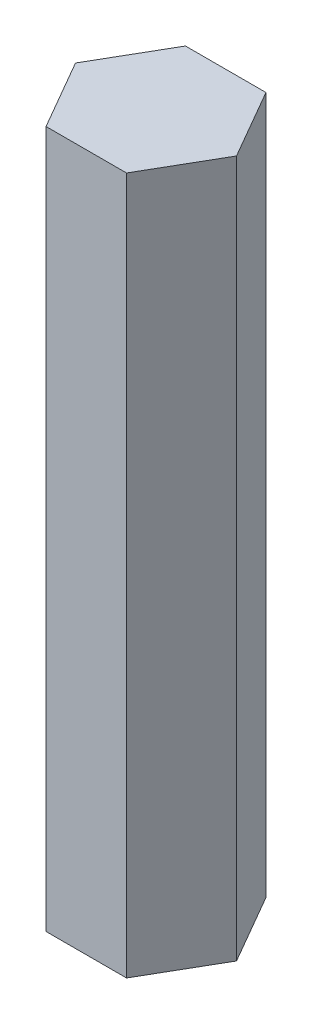
ISO-10303-21;
HEADER;
FILE_DESCRIPTION(('STEP AP214'),'2;1');
FILE_NAME('part.step','',(''),(''),'','','');
FILE_SCHEMA(('AUTOMOTIVE_DESIGN { 1 0 10303 214 1 1 1 1 }'));
ENDSEC;
DATA;
#1=APPLICATION_CONTEXT('core data for automotive mechanical design processes');
#2=APPLICATION_PROTOCOL_DEFINITION('international standard','automotive_design',2000,#1);
#3=PRODUCT_CONTEXT('',#1,'mechanical');
#4=PRODUCT('Part','Part','',(#3));
#5=PRODUCT_RELATED_PRODUCT_CATEGORY('part','',(#4));
#6=PRODUCT_DEFINITION_FORMATION('','',#4);
#7=PRODUCT_DEFINITION_CONTEXT('part definition',#1,'design');
#8=PRODUCT_DEFINITION('design','',#6,#7);
#9=PRODUCT_DEFINITION_SHAPE('','',#8);
#10=(LENGTH_UNIT() NAMED_UNIT(*) SI_UNIT(.MILLI.,.METRE.));
#11=(NAMED_UNIT(*) PLANE_ANGLE_UNIT() SI_UNIT($,.RADIAN.));
#12=(NAMED_UNIT(*) SI_UNIT($,.STERADIAN.) SOLID_ANGLE_UNIT());
#13=UNCERTAINTY_MEASURE_WITH_UNIT(LENGTH_MEASURE(1.E-05),#10,'distance_accuracy_value','');
#14=(GEOMETRIC_REPRESENTATION_CONTEXT(3) GLOBAL_UNCERTAINTY_ASSIGNED_CONTEXT((#13)) GLOBAL_UNIT_ASSIGNED_CONTEXT((#10,
#11,#12)) REPRESENTATION_CONTEXT('',''));
#15=CARTESIAN_POINT('',(0.,0.,0.));
#16=DIRECTION('',(0.,0.,1.));
#17=DIRECTION('',(1.,0.,0.));
#18=AXIS2_PLACEMENT_3D('',#15,#16,#17);
#19=CARTESIAN_POINT('',(3.6661742093542,63.5,6.34999999999996));
#20=DIRECTION('',(-0.866025403784441,0.,-0.499999999999995));
#21=DIRECTION('',(-0.499999999999995,0.,0.866025403784442));
#22=AXIS2_PLACEMENT_3D('',#19,#20,#21);
#23=PLANE('',#22);
#24=DIRECTION('',(0.499999999999995,0.,-0.866025403784441));
#25=VECTOR('',#24,1.);
#26=CARTESIAN_POINT('',(3.6661742093542,0.,6.34999999999996));
#27=LINE('',#26,#25);
#28=CARTESIAN_POINT('',(3.6661742093542,0.,6.34999999999996));
#29=VERTEX_POINT('',#28);
#30=CARTESIAN_POINT('',(7.33234841870825,0.,0.));
#31=VERTEX_POINT('',#30);
#32=EDGE_CURVE('E145',#29,#31,#27,.T.);
#33=ORIENTED_EDGE('',*,*,#32,.T.);
#34=DIRECTION('',(0.,-1.,0.));
#35=VECTOR('',#34,1.);
#36=CARTESIAN_POINT('',(7.33234841870825,63.5,0.));
#37=LINE('',#36,#35);
#38=CARTESIAN_POINT('',(7.33234841870825,63.5,0.));
#39=VERTEX_POINT('',#38);
#40=EDGE_CURVE('E11',#39,#31,#37,.T.);
#41=ORIENTED_EDGE('',*,*,#40,.F.);
#42=DIRECTION('',(0.499999999999995,0.,-0.866025403784441));
#43=VECTOR('',#42,1.);
#44=CARTESIAN_POINT('',(3.6661742093542,63.5,6.34999999999996));
#45=LINE('',#44,#43);
#46=CARTESIAN_POINT('',(3.6661742093542,63.5,6.34999999999996));
#47=VERTEX_POINT('',#46);
#48=EDGE_CURVE('E161',#47,#39,#45,.T.);
#49=ORIENTED_EDGE('',*,*,#48,.F.);
#50=DIRECTION('',(0.,-1.,0.));
#51=VECTOR('',#50,1.);
#52=CARTESIAN_POINT('',(3.6661742093542,63.5,6.34999999999996));
#53=LINE('',#52,#51);
#54=EDGE_CURVE('E141',#47,#29,#53,.T.);
#55=ORIENTED_EDGE('',*,*,#54,.T.);
#56=EDGE_LOOP('',(#33,#41,#49,#55));
#57=FACE_BOUND('',#56,.T.);
#58=ADVANCED_FACE('F45',(#57),#23,.F.);
#59=CARTESIAN_POINT('',(7.33234841870825,63.5,0.));
#60=DIRECTION('',(-0.866025403784438,0.,0.500000000000001));
#61=DIRECTION('',(0.500000000000001,0.,0.866025403784438));
#62=AXIS2_PLACEMENT_3D('',#59,#60,#61);
#63=PLANE('',#62);
#64=DIRECTION('',(-0.500000000000001,0.,-0.866025403784438));
#65=VECTOR('',#64,1.);
#66=CARTESIAN_POINT('',(7.33234841870825,0.,0.));
#67=LINE('',#66,#65);
#68=CARTESIAN_POINT('',(3.66617420935411,0.,-6.35000000000001));
#69=VERTEX_POINT('',#68);
#70=EDGE_CURVE('E149',#31,#69,#67,.T.);
#71=ORIENTED_EDGE('',*,*,#70,.T.);
#72=DIRECTION('',(0.,-1.,0.));
#73=VECTOR('',#72,1.);
#74=CARTESIAN_POINT('',(3.66617420935411,63.5,-6.35000000000001));
#75=LINE('',#74,#73);
#76=CARTESIAN_POINT('',(3.66617420935411,63.5,-6.35000000000001));
#77=VERTEX_POINT('',#76);
#78=EDGE_CURVE('E54',#77,#69,#75,.T.);
#79=ORIENTED_EDGE('',*,*,#78,.F.);
#80=DIRECTION('',(-0.500000000000001,0.,-0.866025403784438));
#81=VECTOR('',#80,1.);
#82=CARTESIAN_POINT('',(7.33234841870825,63.5,0.));
#83=LINE('',#82,#81);
#84=EDGE_CURVE('E107',#39,#77,#83,.T.);
#85=ORIENTED_EDGE('',*,*,#84,.F.);
#86=ORIENTED_EDGE('',*,*,#40,.T.);
#87=EDGE_LOOP('',(#71,#79,#85,#86));
#88=FACE_BOUND('',#87,.T.);
#89=ADVANCED_FACE('F190',(#88),#63,.F.);
#90=CARTESIAN_POINT('',(3.66617420935411,63.5,-6.35000000000001));
#91=DIRECTION('',(0.,0.,1.));
#92=DIRECTION('',(1.,0.,0.));
#93=AXIS2_PLACEMENT_3D('',#90,#91,#92);
#94=PLANE('',#93);
#95=DIRECTION('',(-1.,0.,0.));
#96=VECTOR('',#95,1.);
#97=CARTESIAN_POINT('',(3.66617420935411,0.,-6.35000000000001));
#98=LINE('',#97,#96);
#99=CARTESIAN_POINT('',(-3.66617420935416,0.,-6.34999999999999));
#100=VERTEX_POINT('',#99);
#101=EDGE_CURVE('E152',#69,#100,#98,.T.);
#102=ORIENTED_EDGE('',*,*,#101,.T.);
#103=DIRECTION('',(0.,-1.,0.));
#104=VECTOR('',#103,1.);
#105=CARTESIAN_POINT('',(-3.66617420935416,63.5,-6.34999999999999));
#106=LINE('',#105,#104);
#107=CARTESIAN_POINT('',(-3.66617420935416,63.5,-6.34999999999999));
#108=VERTEX_POINT('',#107);
#109=EDGE_CURVE('E134',#108,#100,#106,.T.);
#110=ORIENTED_EDGE('',*,*,#109,.F.);
#111=DIRECTION('',(-1.,0.,0.));
#112=VECTOR('',#111,1.);
#113=CARTESIAN_POINT('',(3.66617420935411,63.5,-6.35000000000001));
#114=LINE('',#113,#112);
#115=EDGE_CURVE('E123',#77,#108,#114,.T.);
#116=ORIENTED_EDGE('',*,*,#115,.F.);
#117=ORIENTED_EDGE('',*,*,#78,.T.);
#118=EDGE_LOOP('',(#102,#110,#116,#117));
#119=FACE_BOUND('',#118,.T.);
#120=ADVANCED_FACE('F172',(#119),#94,.F.);
#121=CARTESIAN_POINT('',(-3.66617420935416,63.5,-6.34999999999999));
#122=DIRECTION('',(0.866025403784441,0.,0.499999999999995));
#123=DIRECTION('',(0.499999999999995,0.,-0.866025403784442));
#124=AXIS2_PLACEMENT_3D('',#121,#122,#123);
#125=PLANE('',#124);
#126=DIRECTION('',(-0.499999999999995,0.,0.866025403784441));
#127=VECTOR('',#126,1.);
#128=CARTESIAN_POINT('',(-3.66617420935416,0.,-6.34999999999999));
#129=LINE('',#128,#127);
#130=CARTESIAN_POINT('',(-7.33234841870825,0.,0.));
#131=VERTEX_POINT('',#130);
#132=EDGE_CURVE('E132',#100,#131,#129,.T.);
#133=ORIENTED_EDGE('',*,*,#132,.T.);
#134=DIRECTION('',(0.,-1.,0.));
#135=VECTOR('',#134,1.);
#136=CARTESIAN_POINT('',(-7.33234841870825,63.5,0.));
#137=LINE('',#136,#135);
#138=CARTESIAN_POINT('',(-7.33234841870825,63.5,0.));
#139=VERTEX_POINT('',#138);
#140=EDGE_CURVE('E129',#139,#131,#137,.T.);
#141=ORIENTED_EDGE('',*,*,#140,.F.);
#142=DIRECTION('',(-0.499999999999995,0.,0.866025403784441));
#143=VECTOR('',#142,1.);
#144=CARTESIAN_POINT('',(-3.66617420935416,63.5,-6.34999999999999));
#145=LINE('',#144,#143);
#146=EDGE_CURVE('E117',#108,#139,#145,.T.);
#147=ORIENTED_EDGE('',*,*,#146,.F.);
#148=ORIENTED_EDGE('',*,*,#109,.T.);
#149=EDGE_LOOP('',(#133,#141,#147,#148));
#150=FACE_BOUND('',#149,.T.);
#151=ADVANCED_FACE('F130',(#150),#125,.F.);
#152=CARTESIAN_POINT('',(-7.33234841870825,63.5,0.));
#153=DIRECTION('',(0.866025403784435,0.,-0.500000000000007));
#154=DIRECTION('',(-0.500000000000007,0.,-0.866025403784435));
#155=AXIS2_PLACEMENT_3D('',#152,#153,#154);
#156=PLANE('',#155);
#157=DIRECTION('',(0.500000000000007,0.,0.866025403784435));
#158=VECTOR('',#157,1.);
#159=CARTESIAN_POINT('',(-7.33234841870825,0.,0.));
#160=LINE('',#159,#158);
#161=CARTESIAN_POINT('',(-3.66617420935407,0.,6.35000000000004));
#162=VERTEX_POINT('',#161);
#163=EDGE_CURVE('E93',#131,#162,#160,.T.);
#164=ORIENTED_EDGE('',*,*,#163,.T.);
#165=DIRECTION('',(0.,-1.,0.));
#166=VECTOR('',#165,1.);
#167=CARTESIAN_POINT('',(-3.66617420935407,63.5,6.35000000000004));
#168=LINE('',#167,#166);
#169=CARTESIAN_POINT('',(-3.66617420935407,63.5,6.35000000000004));
#170=VERTEX_POINT('',#169);
#171=EDGE_CURVE('E135',#170,#162,#168,.T.);
#172=ORIENTED_EDGE('',*,*,#171,.F.);
#173=DIRECTION('',(0.500000000000007,0.,0.866025403784435));
#174=VECTOR('',#173,1.);
#175=CARTESIAN_POINT('',(-7.33234841870825,63.5,0.));
#176=LINE('',#175,#174);
#177=EDGE_CURVE('E121',#139,#170,#176,.T.);
#178=ORIENTED_EDGE('',*,*,#177,.F.);
#179=ORIENTED_EDGE('',*,*,#140,.T.);
#180=EDGE_LOOP('',(#164,#172,#178,#179));
#181=FACE_BOUND('',#180,.T.);
#182=ADVANCED_FACE('F137',(#181),#156,.F.);
#183=CARTESIAN_POINT('',(-3.66617420935407,63.5,6.35000000000004));
#184=DIRECTION('',(0.,0.,-1.));
#185=DIRECTION('',(-1.,0.,0.));
#186=AXIS2_PLACEMENT_3D('',#183,#184,#185);
#187=PLANE('',#186);
#188=DIRECTION('',(1.,0.,0.));
#189=VECTOR('',#188,1.);
#190=CARTESIAN_POINT('',(-3.66617420935407,0.,6.35000000000004));
#191=LINE('',#190,#189);
#192=EDGE_CURVE('E99',#162,#29,#191,.T.);
#193=ORIENTED_EDGE('',*,*,#192,.T.);
#194=ORIENTED_EDGE('',*,*,#54,.F.);
#195=DIRECTION('',(1.,0.,0.));
#196=VECTOR('',#195,1.);
#197=CARTESIAN_POINT('',(-3.66617420935407,63.5,6.35000000000004));
#198=LINE('',#197,#196);
#199=EDGE_CURVE('E62',#170,#47,#198,.T.);
#200=ORIENTED_EDGE('',*,*,#199,.F.);
#201=ORIENTED_EDGE('',*,*,#171,.T.);
#202=EDGE_LOOP('',(#193,#194,#200,#201));
#203=FACE_BOUND('',#202,.T.);
#204=ADVANCED_FACE('F179',(#203),#187,.F.);
#205=CARTESIAN_POINT('',(0.,63.5,0.));
#206=DIRECTION('',(0.,1.,0.));
#207=DIRECTION('',(0.,0.,1.));
#208=AXIS2_PLACEMENT_3D('',#205,#206,#207);
#209=PLANE('',#208);
#210=ORIENTED_EDGE('',*,*,#48,.T.);
#211=ORIENTED_EDGE('',*,*,#84,.T.);
#212=ORIENTED_EDGE('',*,*,#115,.T.);
#213=ORIENTED_EDGE('',*,*,#146,.T.);
#214=ORIENTED_EDGE('',*,*,#177,.T.);
#215=ORIENTED_EDGE('',*,*,#199,.T.);
#216=EDGE_LOOP('',(#210,#211,#212,#213,#214,#215));
#217=FACE_BOUND('',#216,.T.);
#218=ADVANCED_FACE('F119',(#217),#209,.T.);
#219=CARTESIAN_POINT('',(0.,0.,0.));
#220=DIRECTION('',(0.,1.,0.));
#221=DIRECTION('',(0.,0.,1.));
#222=AXIS2_PLACEMENT_3D('',#219,#220,#221);
#223=PLANE('',#222);
#224=ORIENTED_EDGE('',*,*,#32,.F.);
#225=ORIENTED_EDGE('',*,*,#192,.F.);
#226=ORIENTED_EDGE('',*,*,#163,.F.);
#227=ORIENTED_EDGE('',*,*,#132,.F.);
#228=ORIENTED_EDGE('',*,*,#101,.F.);
#229=ORIENTED_EDGE('',*,*,#70,.F.);
#230=EDGE_LOOP('',(#224,#225,#226,#227,#228,#229));
#231=FACE_BOUND('',#230,.T.);
#232=ADVANCED_FACE('F175',(#231),#223,.F.);
#233=CLOSED_SHELL('',(#58,#89,#120,#151,#182,#204,#218,#232));
#234=MANIFOLD_SOLID_BREP('B2',#233);
#235=ADVANCED_BREP_SHAPE_REPRESENTATION('',(#18,#234),#14);
#236=SHAPE_DEFINITION_REPRESENTATION(#9,#235);
ENDSEC;
END-ISO-10303-21;
